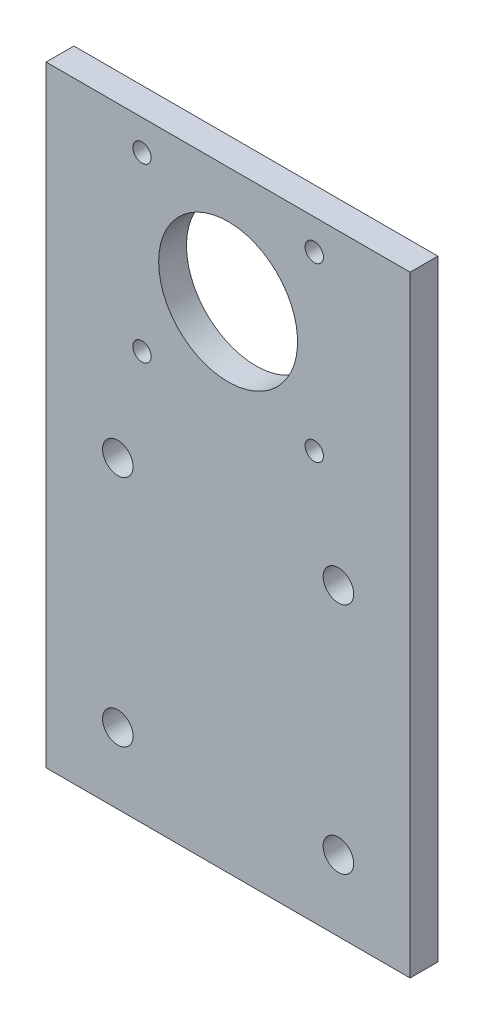
ISO-10303-21;
HEADER;
FILE_DESCRIPTION(('STEP AP214'),'2;1');
FILE_NAME('part.step','',(''),(''),'','','');
FILE_SCHEMA(('AUTOMOTIVE_DESIGN { 1 0 10303 214 1 1 1 1 }'));
ENDSEC;
DATA;
#1=APPLICATION_CONTEXT('core data for automotive mechanical design processes');
#2=APPLICATION_PROTOCOL_DEFINITION('international standard','automotive_design',2000,#1);
#3=PRODUCT_CONTEXT('',#1,'mechanical');
#4=PRODUCT('Part','Part','',(#3));
#5=PRODUCT_RELATED_PRODUCT_CATEGORY('part','',(#4));
#6=PRODUCT_DEFINITION_FORMATION('','',#4);
#7=PRODUCT_DEFINITION_CONTEXT('part definition',#1,'design');
#8=PRODUCT_DEFINITION('design','',#6,#7);
#9=PRODUCT_DEFINITION_SHAPE('','',#8);
#10=(LENGTH_UNIT() NAMED_UNIT(*) SI_UNIT(.MILLI.,.METRE.));
#11=(NAMED_UNIT(*) PLANE_ANGLE_UNIT() SI_UNIT($,.RADIAN.));
#12=(NAMED_UNIT(*) SI_UNIT($,.STERADIAN.) SOLID_ANGLE_UNIT());
#13=UNCERTAINTY_MEASURE_WITH_UNIT(LENGTH_MEASURE(1.E-05),#10,'distance_accuracy_value','');
#14=(GEOMETRIC_REPRESENTATION_CONTEXT(3) GLOBAL_UNCERTAINTY_ASSIGNED_CONTEXT((#13)) GLOBAL_UNIT_ASSIGNED_CONTEXT((#10,
#11,#12)) REPRESENTATION_CONTEXT('',''));
#15=CARTESIAN_POINT('',(0.,0.,0.));
#16=DIRECTION('',(0.,0.,1.));
#17=DIRECTION('',(1.,0.,0.));
#18=AXIS2_PLACEMENT_3D('',#15,#16,#17);
#19=CARTESIAN_POINT('',(-32.75,-55.,5.));
#20=DIRECTION('',(1.,0.,0.));
#21=DIRECTION('',(0.,0.,-1.));
#22=AXIS2_PLACEMENT_3D('',#19,#20,#21);
#23=PLANE('',#22);
#24=DIRECTION('',(0.,-1.,0.));
#25=VECTOR('',#24,1.);
#26=CARTESIAN_POINT('',(-32.75,-55.,0.));
#27=LINE('',#26,#25);
#28=CARTESIAN_POINT('',(-32.75,55.,0.));
#29=VERTEX_POINT('',#28);
#30=CARTESIAN_POINT('',(-32.75,-55.,0.));
#31=VERTEX_POINT('',#30);
#32=EDGE_CURVE('E113',#29,#31,#27,.T.);
#33=ORIENTED_EDGE('',*,*,#32,.T.);
#34=DIRECTION('',(0.,0.,-1.));
#35=VECTOR('',#34,1.);
#36=CARTESIAN_POINT('',(-32.75,-55.,5.));
#37=LINE('',#36,#35);
#38=CARTESIAN_POINT('',(-32.75,-55.,5.));
#39=VERTEX_POINT('',#38);
#40=EDGE_CURVE('E11',#39,#31,#37,.T.);
#41=ORIENTED_EDGE('',*,*,#40,.F.);
#42=DIRECTION('',(0.,-1.,0.));
#43=VECTOR('',#42,1.);
#44=CARTESIAN_POINT('',(-32.75,-55.,5.));
#45=LINE('',#44,#43);
#46=CARTESIAN_POINT('',(-32.75,55.,5.));
#47=VERTEX_POINT('',#46);
#48=EDGE_CURVE('E97',#47,#39,#45,.T.);
#49=ORIENTED_EDGE('',*,*,#48,.F.);
#50=DIRECTION('',(0.,0.,-1.));
#51=VECTOR('',#50,1.);
#52=CARTESIAN_POINT('',(-32.75,55.,5.));
#53=LINE('',#52,#51);
#54=EDGE_CURVE('E109',#47,#29,#53,.T.);
#55=ORIENTED_EDGE('',*,*,#54,.T.);
#56=EDGE_LOOP('',(#33,#41,#49,#55));
#57=FACE_BOUND('',#56,.T.);
#58=ADVANCED_FACE('F45',(#57),#23,.F.);
#59=CARTESIAN_POINT('',(32.75,-55.,5.));
#60=DIRECTION('',(0.,1.,0.));
#61=DIRECTION('',(-1.,0.,0.));
#62=AXIS2_PLACEMENT_3D('',#59,#60,#61);
#63=PLANE('',#62);
#64=DIRECTION('',(1.,0.,0.));
#65=VECTOR('',#64,1.);
#66=CARTESIAN_POINT('',(32.75,-55.,0.));
#67=LINE('',#66,#65);
#68=CARTESIAN_POINT('',(32.75,-55.,0.));
#69=VERTEX_POINT('',#68);
#70=EDGE_CURVE('E102',#31,#69,#67,.T.);
#71=ORIENTED_EDGE('',*,*,#70,.T.);
#72=DIRECTION('',(0.,0.,-1.));
#73=VECTOR('',#72,1.);
#74=CARTESIAN_POINT('',(32.75,-55.,5.));
#75=LINE('',#74,#73);
#76=CARTESIAN_POINT('',(32.75,-55.,5.));
#77=VERTEX_POINT('',#76);
#78=EDGE_CURVE('E54',#77,#69,#75,.T.);
#79=ORIENTED_EDGE('',*,*,#78,.F.);
#80=DIRECTION('',(1.,0.,0.));
#81=VECTOR('',#80,1.);
#82=CARTESIAN_POINT('',(32.75,-55.,5.));
#83=LINE('',#82,#81);
#84=EDGE_CURVE('E92',#39,#77,#83,.T.);
#85=ORIENTED_EDGE('',*,*,#84,.F.);
#86=ORIENTED_EDGE('',*,*,#40,.T.);
#87=EDGE_LOOP('',(#71,#79,#85,#86));
#88=FACE_BOUND('',#87,.T.);
#89=ADVANCED_FACE('F101',(#88),#63,.F.);
#90=CARTESIAN_POINT('',(32.75,-55.,5.));
#91=DIRECTION('',(-1.,0.,0.));
#92=DIRECTION('',(0.,0.,1.));
#93=AXIS2_PLACEMENT_3D('',#90,#91,#92);
#94=PLANE('',#93);
#95=DIRECTION('',(0.,1.,0.));
#96=VECTOR('',#95,1.);
#97=CARTESIAN_POINT('',(32.75,-55.,0.));
#98=LINE('',#97,#96);
#99=CARTESIAN_POINT('',(32.75,55.,0.));
#100=VERTEX_POINT('',#99);
#101=EDGE_CURVE('E79',#69,#100,#98,.T.);
#102=ORIENTED_EDGE('',*,*,#101,.T.);
#103=DIRECTION('',(0.,0.,-1.));
#104=VECTOR('',#103,1.);
#105=CARTESIAN_POINT('',(32.75,55.,5.));
#106=LINE('',#105,#104);
#107=CARTESIAN_POINT('',(32.75,55.,5.));
#108=VERTEX_POINT('',#107);
#109=EDGE_CURVE('E104',#108,#100,#106,.T.);
#110=ORIENTED_EDGE('',*,*,#109,.F.);
#111=DIRECTION('',(0.,1.,0.));
#112=VECTOR('',#111,1.);
#113=CARTESIAN_POINT('',(32.75,-55.,5.));
#114=LINE('',#113,#112);
#115=EDGE_CURVE('E95',#77,#108,#114,.T.);
#116=ORIENTED_EDGE('',*,*,#115,.F.);
#117=ORIENTED_EDGE('',*,*,#78,.T.);
#118=EDGE_LOOP('',(#102,#110,#116,#117));
#119=FACE_BOUND('',#118,.T.);
#120=ADVANCED_FACE('F105',(#119),#94,.F.);
#121=CARTESIAN_POINT('',(32.75,55.,5.));
#122=DIRECTION('',(0.,-1.,0.));
#123=DIRECTION('',(1.,0.,0.));
#124=AXIS2_PLACEMENT_3D('',#121,#122,#123);
#125=PLANE('',#124);
#126=DIRECTION('',(-1.,0.,0.));
#127=VECTOR('',#126,1.);
#128=CARTESIAN_POINT('',(32.75,55.,0.));
#129=LINE('',#128,#127);
#130=EDGE_CURVE('E85',#100,#29,#129,.T.);
#131=ORIENTED_EDGE('',*,*,#130,.T.);
#132=ORIENTED_EDGE('',*,*,#54,.F.);
#133=DIRECTION('',(-1.,0.,0.));
#134=VECTOR('',#133,1.);
#135=CARTESIAN_POINT('',(32.75,55.,5.));
#136=LINE('',#135,#134);
#137=EDGE_CURVE('E62',#108,#47,#136,.T.);
#138=ORIENTED_EDGE('',*,*,#137,.F.);
#139=ORIENTED_EDGE('',*,*,#109,.T.);
#140=EDGE_LOOP('',(#131,#132,#138,#139));
#141=FACE_BOUND('',#140,.T.);
#142=ADVANCED_FACE('F127',(#141),#125,.F.);
#143=CARTESIAN_POINT('',(0.,0.,5.));
#144=DIRECTION('',(0.,0.,1.));
#145=DIRECTION('',(1.,0.,0.));
#146=AXIS2_PLACEMENT_3D('',#143,#144,#145);
#147=PLANE('',#146);
#148=CARTESIAN_POINT('',(19.8499999999933,-42.2500000000279,5.));
#149=DIRECTION('',(0.,0.,-1.));
#150=DIRECTION('',(-1.,0.,0.));
#151=AXIS2_PLACEMENT_3D('',#148,#149,#150);
#152=CIRCLE('',#151,2.75);
#153=CARTESIAN_POINT('',(17.0999999999933,-42.2500000000279,5.));
#154=VERTEX_POINT('',#153);
#155=EDGE_CURVE('E182',#154,#154,#152,.T.);
#156=ORIENTED_EDGE('',*,*,#155,.T.);
#157=EDGE_LOOP('',(#156));
#158=FACE_BOUND('',#157,.T.);
#159=CARTESIAN_POINT('',(-19.850000000007,-42.2500000000279,5.));
#160=DIRECTION('',(0.,0.,-1.));
#161=DIRECTION('',(-1.,0.,0.));
#162=AXIS2_PLACEMENT_3D('',#159,#160,#161);
#163=CIRCLE('',#162,2.75);
#164=CARTESIAN_POINT('',(-22.600000000007,-42.2500000000279,5.));
#165=VERTEX_POINT('',#164);
#166=EDGE_CURVE('E190',#165,#165,#163,.T.);
#167=ORIENTED_EDGE('',*,*,#166,.T.);
#168=EDGE_LOOP('',(#167));
#169=FACE_BOUND('',#168,.T.);
#170=CARTESIAN_POINT('',(-19.8500000000068,-0.250000000027874,5.));
#171=DIRECTION('',(0.,0.,-1.));
#172=DIRECTION('',(-1.,0.,0.));
#173=AXIS2_PLACEMENT_3D('',#170,#171,#172);
#174=CIRCLE('',#173,2.75);
#175=CARTESIAN_POINT('',(-22.6000000000068,-0.250000000027874,5.));
#176=VERTEX_POINT('',#175);
#177=EDGE_CURVE('E198',#176,#176,#174,.T.);
#178=ORIENTED_EDGE('',*,*,#177,.T.);
#179=EDGE_LOOP('',(#178));
#180=FACE_BOUND('',#179,.T.);
#181=CARTESIAN_POINT('',(19.8499999999933,-0.250000000027902,5.));
#182=DIRECTION('',(0.,0.,-1.));
#183=DIRECTION('',(-1.,0.,0.));
#184=AXIS2_PLACEMENT_3D('',#181,#182,#183);
#185=CIRCLE('',#184,2.75);
#186=CARTESIAN_POINT('',(17.0999999999933,-0.250000000027902,5.));
#187=VERTEX_POINT('',#186);
#188=EDGE_CURVE('E155',#187,#187,#185,.T.);
#189=ORIENTED_EDGE('',*,*,#188,.T.);
#190=EDGE_LOOP('',(#189));
#191=FACE_BOUND('',#190,.T.);
#192=CARTESIAN_POINT('',(-15.4999999999967,49.5250000000006,5.));
#193=DIRECTION('',(0.,0.,-1.));
#194=DIRECTION('',(-1.,0.,0.));
#195=AXIS2_PLACEMENT_3D('',#192,#193,#194);
#196=CIRCLE('',#195,1.64999999999839);
#197=CARTESIAN_POINT('',(-17.1499999999951,49.5250000000006,5.));
#198=VERTEX_POINT('',#197);
#199=EDGE_CURVE('E150',#198,#198,#196,.T.);
#200=ORIENTED_EDGE('',*,*,#199,.T.);
#201=EDGE_LOOP('',(#200));
#202=FACE_BOUND('',#201,.T.);
#203=CARTESIAN_POINT('',(-15.4999999999967,18.5250000000006,5.));
#204=DIRECTION('',(0.,0.,-1.));
#205=DIRECTION('',(-1.,0.,0.));
#206=AXIS2_PLACEMENT_3D('',#203,#204,#205);
#207=CIRCLE('',#206,1.64999999999859);
#208=CARTESIAN_POINT('',(-17.1499999999953,18.5250000000006,5.));
#209=VERTEX_POINT('',#208);
#210=EDGE_CURVE('E159',#209,#209,#207,.T.);
#211=ORIENTED_EDGE('',*,*,#210,.T.);
#212=EDGE_LOOP('',(#211));
#213=FACE_BOUND('',#212,.T.);
#214=CARTESIAN_POINT('',(15.5000000000033,18.5250000000006,5.));
#215=DIRECTION('',(0.,0.,-1.));
#216=DIRECTION('',(-1.,0.,0.));
#217=AXIS2_PLACEMENT_3D('',#214,#215,#216);
#218=CIRCLE('',#217,1.64999999999851);
#219=CARTESIAN_POINT('',(13.8500000000048,18.5250000000006,5.));
#220=VERTEX_POINT('',#219);
#221=EDGE_CURVE('E167',#220,#220,#218,.T.);
#222=ORIENTED_EDGE('',*,*,#221,.T.);
#223=EDGE_LOOP('',(#222));
#224=FACE_BOUND('',#223,.T.);
#225=CARTESIAN_POINT('',(15.5000000000033,49.5250000000006,5.));
#226=DIRECTION('',(0.,0.,-1.));
#227=DIRECTION('',(-1.,0.,0.));
#228=AXIS2_PLACEMENT_3D('',#225,#226,#227);
#229=CIRCLE('',#228,1.64999999999833);
#230=CARTESIAN_POINT('',(13.850000000005,49.5250000000006,5.));
#231=VERTEX_POINT('',#230);
#232=EDGE_CURVE('E138',#231,#231,#229,.T.);
#233=ORIENTED_EDGE('',*,*,#232,.T.);
#234=EDGE_LOOP('',(#233));
#235=FACE_BOUND('',#234,.T.);
#236=CARTESIAN_POINT('',(3.33066907387547E-12,34.0250000000006,5.));
#237=DIRECTION('',(0.,0.,-1.));
#238=DIRECTION('',(-1.,0.,0.));
#239=AXIS2_PLACEMENT_3D('',#236,#237,#238);
#240=CIRCLE('',#239,12.4999999999983);
#241=CARTESIAN_POINT('',(-12.499999999995,34.0250000000006,5.));
#242=VERTEX_POINT('',#241);
#243=EDGE_CURVE('E117',#242,#242,#240,.T.);
#244=ORIENTED_EDGE('',*,*,#243,.T.);
#245=EDGE_LOOP('',(#244));
#246=FACE_BOUND('',#245,.T.);
#247=ORIENTED_EDGE('',*,*,#48,.T.);
#248=ORIENTED_EDGE('',*,*,#84,.T.);
#249=ORIENTED_EDGE('',*,*,#115,.T.);
#250=ORIENTED_EDGE('',*,*,#137,.T.);
#251=EDGE_LOOP('',(#247,#248,#249,#250));
#252=FACE_BOUND('',#251,.T.);
#253=ADVANCED_FACE('F93',(#158,#169,#180,#191,#202,#213,#224,#235,#246,#252),#147,.T.);
#254=CARTESIAN_POINT('',(0.,0.,0.));
#255=DIRECTION('',(0.,0.,1.));
#256=DIRECTION('',(1.,0.,0.));
#257=AXIS2_PLACEMENT_3D('',#254,#255,#256);
#258=PLANE('',#257);
#259=CARTESIAN_POINT('',(19.8499999999933,-42.2500000000279,0.));
#260=DIRECTION('',(0.,0.,-1.));
#261=DIRECTION('',(-1.,0.,0.));
#262=AXIS2_PLACEMENT_3D('',#259,#260,#261);
#263=CIRCLE('',#262,2.75);
#264=CARTESIAN_POINT('',(17.0999999999933,-42.2500000000279,0.));
#265=VERTEX_POINT('',#264);
#266=EDGE_CURVE('E186',#265,#265,#263,.T.);
#267=ORIENTED_EDGE('',*,*,#266,.F.);
#268=EDGE_LOOP('',(#267));
#269=FACE_BOUND('',#268,.T.);
#270=CARTESIAN_POINT('',(-19.850000000007,-42.2500000000279,0.));
#271=DIRECTION('',(0.,0.,-1.));
#272=DIRECTION('',(-1.,0.,0.));
#273=AXIS2_PLACEMENT_3D('',#270,#271,#272);
#274=CIRCLE('',#273,2.75);
#275=CARTESIAN_POINT('',(-22.600000000007,-42.2500000000279,0.));
#276=VERTEX_POINT('',#275);
#277=EDGE_CURVE('E194',#276,#276,#274,.T.);
#278=ORIENTED_EDGE('',*,*,#277,.F.);
#279=EDGE_LOOP('',(#278));
#280=FACE_BOUND('',#279,.T.);
#281=CARTESIAN_POINT('',(-19.8500000000068,-0.250000000027874,0.));
#282=DIRECTION('',(0.,0.,-1.));
#283=DIRECTION('',(-1.,0.,0.));
#284=AXIS2_PLACEMENT_3D('',#281,#282,#283);
#285=CIRCLE('',#284,2.75);
#286=CARTESIAN_POINT('',(-22.6000000000068,-0.250000000027874,0.));
#287=VERTEX_POINT('',#286);
#288=EDGE_CURVE('E178',#287,#287,#285,.T.);
#289=ORIENTED_EDGE('',*,*,#288,.F.);
#290=EDGE_LOOP('',(#289));
#291=FACE_BOUND('',#290,.T.);
#292=CARTESIAN_POINT('',(19.8499999999933,-0.250000000027902,0.));
#293=DIRECTION('',(0.,0.,-1.));
#294=DIRECTION('',(-1.,0.,0.));
#295=AXIS2_PLACEMENT_3D('',#292,#293,#294);
#296=CIRCLE('',#295,2.75);
#297=CARTESIAN_POINT('',(17.0999999999933,-0.250000000027902,0.));
#298=VERTEX_POINT('',#297);
#299=EDGE_CURVE('E174',#298,#298,#296,.T.);
#300=ORIENTED_EDGE('',*,*,#299,.F.);
#301=EDGE_LOOP('',(#300));
#302=FACE_BOUND('',#301,.T.);
#303=CARTESIAN_POINT('',(-15.4999999999967,49.5250000000006,0.));
#304=DIRECTION('',(0.,0.,-1.));
#305=DIRECTION('',(-1.,0.,0.));
#306=AXIS2_PLACEMENT_3D('',#303,#304,#305);
#307=CIRCLE('',#306,1.64999999999839);
#308=CARTESIAN_POINT('',(-17.1499999999951,49.5250000000006,0.));
#309=VERTEX_POINT('',#308);
#310=EDGE_CURVE('E154',#309,#309,#307,.T.);
#311=ORIENTED_EDGE('',*,*,#310,.F.);
#312=EDGE_LOOP('',(#311));
#313=FACE_BOUND('',#312,.T.);
#314=CARTESIAN_POINT('',(-15.4999999999967,18.5250000000006,0.));
#315=DIRECTION('',(0.,0.,-1.));
#316=DIRECTION('',(-1.,0.,0.));
#317=AXIS2_PLACEMENT_3D('',#314,#315,#316);
#318=CIRCLE('',#317,1.64999999999859);
#319=CARTESIAN_POINT('',(-17.1499999999953,18.5250000000006,0.));
#320=VERTEX_POINT('',#319);
#321=EDGE_CURVE('E163',#320,#320,#318,.T.);
#322=ORIENTED_EDGE('',*,*,#321,.F.);
#323=EDGE_LOOP('',(#322));
#324=FACE_BOUND('',#323,.T.);
#325=CARTESIAN_POINT('',(15.5000000000033,18.5250000000006,0.));
#326=DIRECTION('',(0.,0.,-1.));
#327=DIRECTION('',(-1.,0.,0.));
#328=AXIS2_PLACEMENT_3D('',#325,#326,#327);
#329=CIRCLE('',#328,1.64999999999851);
#330=CARTESIAN_POINT('',(13.8500000000048,18.5250000000006,0.));
#331=VERTEX_POINT('',#330);
#332=EDGE_CURVE('E146',#331,#331,#329,.T.);
#333=ORIENTED_EDGE('',*,*,#332,.F.);
#334=EDGE_LOOP('',(#333));
#335=FACE_BOUND('',#334,.T.);
#336=CARTESIAN_POINT('',(15.5000000000033,49.5250000000006,0.));
#337=DIRECTION('',(0.,0.,-1.));
#338=DIRECTION('',(-1.,0.,0.));
#339=AXIS2_PLACEMENT_3D('',#336,#337,#338);
#340=CIRCLE('',#339,1.64999999999833);
#341=CARTESIAN_POINT('',(13.850000000005,49.5250000000006,0.));
#342=VERTEX_POINT('',#341);
#343=EDGE_CURVE('E142',#342,#342,#340,.T.);
#344=ORIENTED_EDGE('',*,*,#343,.F.);
#345=EDGE_LOOP('',(#344));
#346=FACE_BOUND('',#345,.T.);
#347=CARTESIAN_POINT('',(3.33066907387547E-12,34.0250000000006,0.));
#348=DIRECTION('',(0.,0.,-1.));
#349=DIRECTION('',(-1.,0.,0.));
#350=AXIS2_PLACEMENT_3D('',#347,#348,#349);
#351=CIRCLE('',#350,12.4999999999983);
#352=CARTESIAN_POINT('',(-12.499999999995,34.0250000000006,0.));
#353=VERTEX_POINT('',#352);
#354=EDGE_CURVE('E134',#353,#353,#351,.T.);
#355=ORIENTED_EDGE('',*,*,#354,.F.);
#356=EDGE_LOOP('',(#355));
#357=FACE_BOUND('',#356,.T.);
#358=ORIENTED_EDGE('',*,*,#32,.F.);
#359=ORIENTED_EDGE('',*,*,#130,.F.);
#360=ORIENTED_EDGE('',*,*,#101,.F.);
#361=ORIENTED_EDGE('',*,*,#70,.F.);
#362=EDGE_LOOP('',(#358,#359,#360,#361));
#363=FACE_BOUND('',#362,.T.);
#364=ADVANCED_FACE('F130',(#269,#280,#291,#302,#313,#324,#335,#346,#357,#363),#258,.F.);
#365=CARTESIAN_POINT('',(3.33066907387547E-12,34.0250000000006,5.));
#366=DIRECTION('',(0.,0.,-1.));
#367=DIRECTION('',(-1.,0.,0.));
#368=AXIS2_PLACEMENT_3D('',#365,#366,#367);
#369=CYLINDRICAL_SURFACE('',#368,12.4999999999983);
#370=ORIENTED_EDGE('',*,*,#243,.F.);
#371=EDGE_LOOP('',(#370));
#372=FACE_BOUND('',#371,.T.);
#373=ORIENTED_EDGE('',*,*,#354,.T.);
#374=EDGE_LOOP('',(#373));
#375=FACE_BOUND('',#374,.T.);
#376=ADVANCED_FACE('F210',(#372,#375),#369,.F.);
#377=CARTESIAN_POINT('',(15.5000000000033,49.5250000000006,5.));
#378=DIRECTION('',(0.,0.,-1.));
#379=DIRECTION('',(-1.,0.,0.));
#380=AXIS2_PLACEMENT_3D('',#377,#378,#379);
#381=CYLINDRICAL_SURFACE('',#380,1.64999999999833);
#382=ORIENTED_EDGE('',*,*,#232,.F.);
#383=EDGE_LOOP('',(#382));
#384=FACE_BOUND('',#383,.T.);
#385=ORIENTED_EDGE('',*,*,#343,.T.);
#386=EDGE_LOOP('',(#385));
#387=FACE_BOUND('',#386,.T.);
#388=ADVANCED_FACE('F226',(#384,#387),#381,.F.);
#389=CARTESIAN_POINT('',(15.5000000000033,18.5250000000006,5.));
#390=DIRECTION('',(0.,0.,-1.));
#391=DIRECTION('',(-1.,0.,0.));
#392=AXIS2_PLACEMENT_3D('',#389,#390,#391);
#393=CYLINDRICAL_SURFACE('',#392,1.64999999999851);
#394=ORIENTED_EDGE('',*,*,#221,.F.);
#395=EDGE_LOOP('',(#394));
#396=FACE_BOUND('',#395,.T.);
#397=ORIENTED_EDGE('',*,*,#332,.T.);
#398=EDGE_LOOP('',(#397));
#399=FACE_BOUND('',#398,.T.);
#400=ADVANCED_FACE('F233',(#396,#399),#393,.F.);
#401=CARTESIAN_POINT('',(-15.4999999999967,18.5250000000006,5.));
#402=DIRECTION('',(0.,0.,-1.));
#403=DIRECTION('',(-1.,0.,0.));
#404=AXIS2_PLACEMENT_3D('',#401,#402,#403);
#405=CYLINDRICAL_SURFACE('',#404,1.64999999999859);
#406=ORIENTED_EDGE('',*,*,#210,.F.);
#407=EDGE_LOOP('',(#406));
#408=FACE_BOUND('',#407,.T.);
#409=ORIENTED_EDGE('',*,*,#321,.T.);
#410=EDGE_LOOP('',(#409));
#411=FACE_BOUND('',#410,.T.);
#412=ADVANCED_FACE('F272',(#408,#411),#405,.F.);
#413=CARTESIAN_POINT('',(-15.4999999999967,49.5250000000006,5.));
#414=DIRECTION('',(0.,0.,-1.));
#415=DIRECTION('',(-1.,0.,0.));
#416=AXIS2_PLACEMENT_3D('',#413,#414,#415);
#417=CYLINDRICAL_SURFACE('',#416,1.64999999999839);
#418=ORIENTED_EDGE('',*,*,#199,.F.);
#419=EDGE_LOOP('',(#418));
#420=FACE_BOUND('',#419,.T.);
#421=ORIENTED_EDGE('',*,*,#310,.T.);
#422=EDGE_LOOP('',(#421));
#423=FACE_BOUND('',#422,.T.);
#424=ADVANCED_FACE('F277',(#420,#423),#417,.F.);
#425=CARTESIAN_POINT('',(19.8499999999933,-0.250000000027902,5.));
#426=DIRECTION('',(0.,0.,-1.));
#427=DIRECTION('',(-1.,0.,0.));
#428=AXIS2_PLACEMENT_3D('',#425,#426,#427);
#429=CYLINDRICAL_SURFACE('',#428,2.75);
#430=ORIENTED_EDGE('',*,*,#188,.F.);
#431=EDGE_LOOP('',(#430));
#432=FACE_BOUND('',#431,.T.);
#433=ORIENTED_EDGE('',*,*,#299,.T.);
#434=EDGE_LOOP('',(#433));
#435=FACE_BOUND('',#434,.T.);
#436=ADVANCED_FACE('F281',(#432,#435),#429,.F.);
#437=CARTESIAN_POINT('',(-19.8500000000068,-0.250000000027874,5.));
#438=DIRECTION('',(0.,0.,-1.));
#439=DIRECTION('',(-1.,0.,0.));
#440=AXIS2_PLACEMENT_3D('',#437,#438,#439);
#441=CYLINDRICAL_SURFACE('',#440,2.75);
#442=ORIENTED_EDGE('',*,*,#177,.F.);
#443=EDGE_LOOP('',(#442));
#444=FACE_BOUND('',#443,.T.);
#445=ORIENTED_EDGE('',*,*,#288,.T.);
#446=EDGE_LOOP('',(#445));
#447=FACE_BOUND('',#446,.T.);
#448=ADVANCED_FACE('F206',(#444,#447),#441,.F.);
#449=CARTESIAN_POINT('',(-19.850000000007,-42.2500000000279,5.));
#450=DIRECTION('',(0.,0.,-1.));
#451=DIRECTION('',(-1.,0.,0.));
#452=AXIS2_PLACEMENT_3D('',#449,#450,#451);
#453=CYLINDRICAL_SURFACE('',#452,2.75);
#454=ORIENTED_EDGE('',*,*,#166,.F.);
#455=EDGE_LOOP('',(#454));
#456=FACE_BOUND('',#455,.T.);
#457=ORIENTED_EDGE('',*,*,#277,.T.);
#458=EDGE_LOOP('',(#457));
#459=FACE_BOUND('',#458,.T.);
#460=ADVANCED_FACE('F293',(#456,#459),#453,.F.);
#461=CARTESIAN_POINT('',(19.8499999999933,-42.2500000000279,5.));
#462=DIRECTION('',(0.,0.,-1.));
#463=DIRECTION('',(-1.,0.,0.));
#464=AXIS2_PLACEMENT_3D('',#461,#462,#463);
#465=CYLINDRICAL_SURFACE('',#464,2.75);
#466=ORIENTED_EDGE('',*,*,#155,.F.);
#467=EDGE_LOOP('',(#466));
#468=FACE_BOUND('',#467,.T.);
#469=ORIENTED_EDGE('',*,*,#266,.T.);
#470=EDGE_LOOP('',(#469));
#471=FACE_BOUND('',#470,.T.);
#472=ADVANCED_FACE('F300',(#468,#471),#465,.F.);
#473=CLOSED_SHELL('',(#58,#89,#120,#142,#253,#364,#376,#388,#400,#412,#424,#436,#448,#460,#472));
#474=MANIFOLD_SOLID_BREP('B2',#473);
#475=ADVANCED_BREP_SHAPE_REPRESENTATION('',(#18,#474),#14);
#476=SHAPE_DEFINITION_REPRESENTATION(#9,#475);
ENDSEC;
END-ISO-10303-21;
